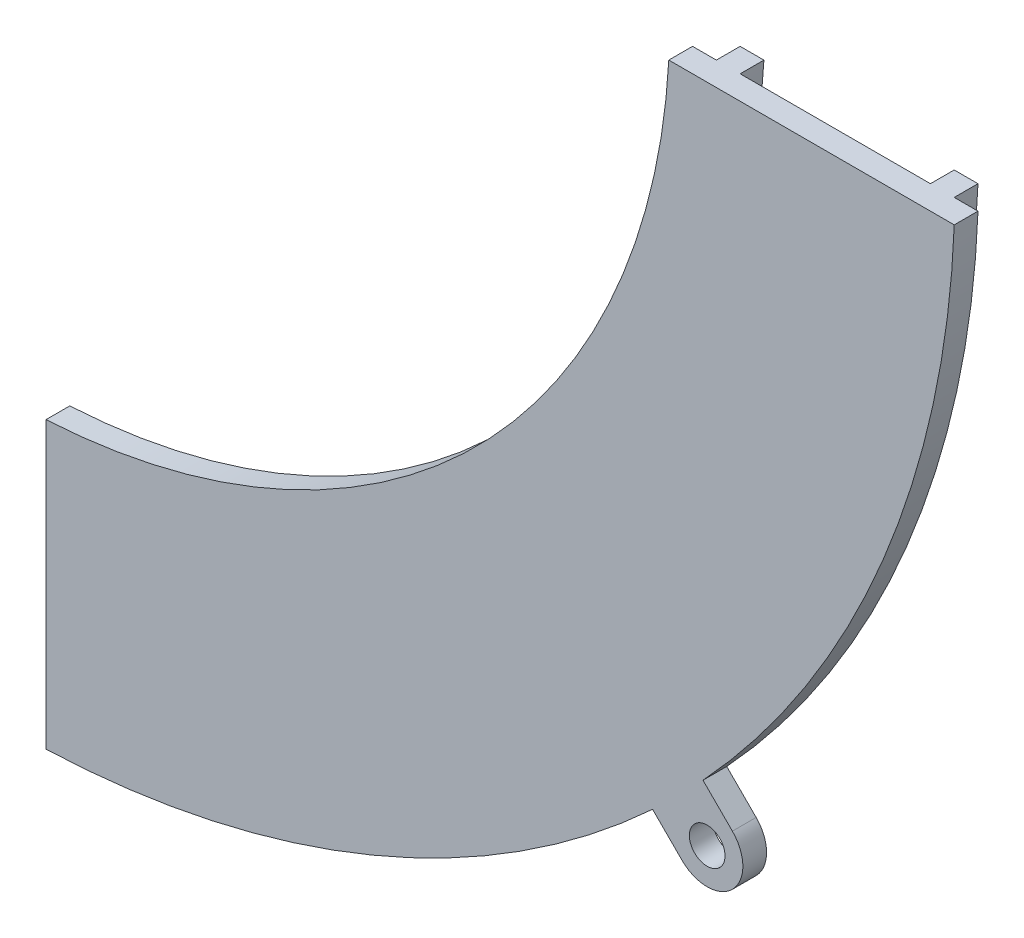
ISO-10303-21;
HEADER;
FILE_DESCRIPTION(('STEP AP214'),'2;1');
FILE_NAME('part.step','',(''),(''),'','','');
FILE_SCHEMA(('AUTOMOTIVE_DESIGN { 1 0 10303 214 1 1 1 1 }'));
ENDSEC;
DATA;
#1=APPLICATION_CONTEXT('core data for automotive mechanical design processes');
#2=APPLICATION_PROTOCOL_DEFINITION('international standard','automotive_design',2000,#1);
#3=PRODUCT_CONTEXT('',#1,'mechanical');
#4=PRODUCT('Part','Part','',(#3));
#5=PRODUCT_RELATED_PRODUCT_CATEGORY('part','',(#4));
#6=PRODUCT_DEFINITION_FORMATION('','',#4);
#7=PRODUCT_DEFINITION_CONTEXT('part definition',#1,'design');
#8=PRODUCT_DEFINITION('design','',#6,#7);
#9=PRODUCT_DEFINITION_SHAPE('','',#8);
#10=(LENGTH_UNIT() NAMED_UNIT(*) SI_UNIT(.MILLI.,.METRE.));
#11=(NAMED_UNIT(*) PLANE_ANGLE_UNIT() SI_UNIT($,.RADIAN.));
#12=(NAMED_UNIT(*) SI_UNIT($,.STERADIAN.) SOLID_ANGLE_UNIT());
#13=UNCERTAINTY_MEASURE_WITH_UNIT(LENGTH_MEASURE(1.E-05),#10,'distance_accuracy_value','');
#14=(GEOMETRIC_REPRESENTATION_CONTEXT(3) GLOBAL_UNCERTAINTY_ASSIGNED_CONTEXT((#13)) GLOBAL_UNIT_ASSIGNED_CONTEXT((#10,
#11,#12)) REPRESENTATION_CONTEXT('',''));
#15=CARTESIAN_POINT('',(0.,0.,0.));
#16=DIRECTION('',(0.,0.,1.));
#17=DIRECTION('',(1.,0.,0.));
#18=AXIS2_PLACEMENT_3D('',#15,#16,#17);
#19=CARTESIAN_POINT('',(0.,0.,2.));
#20=DIRECTION('',(0.,0.,-1.));
#21=DIRECTION('',(-1.,0.,0.));
#22=AXIS2_PLACEMENT_3D('',#19,#20,#21);
#23=CYLINDRICAL_SURFACE('',#22,79.5);
#24=DIRECTION('',(0.,0.,1.));
#25=VECTOR('',#24,1.);
#26=CARTESIAN_POINT('',(58.2962702767819,-54.0536295896621,0.));
#27=LINE('',#26,#25);
#28=CARTESIAN_POINT('',(58.2962702767819,-54.0536295896621,0.));
#29=VERTEX_POINT('',#28);
#30=CARTESIAN_POINT('',(58.2962702767817,-54.0536295896623,2.));
#31=VERTEX_POINT('',#30);
#32=EDGE_CURVE('E181',#29,#31,#27,.T.);
#33=ORIENTED_EDGE('',*,*,#32,.F.);
#34=CARTESIAN_POINT('',(0.,0.,0.));
#35=DIRECTION('',(0.,0.,1.));
#36=DIRECTION('',(1.,0.,0.));
#37=AXIS2_PLACEMENT_3D('',#34,#35,#36);
#38=CIRCLE('',#37,79.5);
#39=CARTESIAN_POINT('',(79.4433760611922,-3.,0.));
#40=VERTEX_POINT('',#39);
#41=EDGE_CURVE('E169',#29,#40,#38,.T.);
#42=ORIENTED_EDGE('',*,*,#41,.T.);
#43=DIRECTION('',(0.,0.,-1.));
#44=VECTOR('',#43,1.);
#45=CARTESIAN_POINT('',(79.4433760611922,-3.,2.));
#46=LINE('',#45,#44);
#47=CARTESIAN_POINT('',(79.4433760611922,-3.,2.));
#48=VERTEX_POINT('',#47);
#49=EDGE_CURVE('E56',#48,#40,#46,.T.);
#50=ORIENTED_EDGE('',*,*,#49,.F.);
#51=CARTESIAN_POINT('',(0.,0.,2.));
#52=DIRECTION('',(0.,0.,1.));
#53=DIRECTION('',(1.,0.,0.));
#54=AXIS2_PLACEMENT_3D('',#51,#52,#53);
#55=CIRCLE('',#54,79.5);
#56=EDGE_CURVE('E293',#31,#48,#55,.T.);
#57=ORIENTED_EDGE('',*,*,#56,.F.);
#58=EDGE_LOOP('',(#33,#42,#50,#57));
#59=FACE_BOUND('',#58,.T.);
#60=ADVANCED_FACE('F47',(#59),#23,.T.);
#61=CARTESIAN_POINT('',(0.,0.,0.));
#62=DIRECTION('',(0.,0.,1.));
#63=DIRECTION('',(1.,0.,0.));
#64=AXIS2_PLACEMENT_3D('',#61,#62,#63);
#65=PLANE('',#64);
#66=DIRECTION('',(1.,0.,0.));
#67=VECTOR('',#66,1.);
#68=CARTESIAN_POINT('',(0.,-3.,0.));
#69=LINE('',#68,#67);
#70=CARTESIAN_POINT('',(59.4243216200236,-3.,0.));
#71=VERTEX_POINT('',#70);
#72=CARTESIAN_POINT('',(75.4403738060728,-3.,0.));
#73=VERTEX_POINT('',#72);
#74=EDGE_CURVE('E322',#71,#73,#69,.T.);
#75=ORIENTED_EDGE('',*,*,#74,.T.);
#76=CARTESIAN_POINT('',(0.,0.,0.));
#77=DIRECTION('',(0.,0.,-1.));
#78=DIRECTION('',(1.,0.,0.));
#79=AXIS2_PLACEMENT_3D('',#76,#77,#78);
#80=CIRCLE('',#79,75.5);
#81=CARTESIAN_POINT('',(3.00000000000001,-75.4403738060728,0.));
#82=VERTEX_POINT('',#81);
#83=EDGE_CURVE('E235',#73,#82,#80,.T.);
#84=ORIENTED_EDGE('',*,*,#83,.T.);
#85=DIRECTION('',(0.,-1.,0.));
#86=VECTOR('',#85,1.);
#87=CARTESIAN_POINT('',(3.00000000000001,0.,0.));
#88=LINE('',#87,#86);
#89=CARTESIAN_POINT('',(3.00000000000001,-59.4243216200236,0.));
#90=VERTEX_POINT('',#89);
#91=EDGE_CURVE('E312',#90,#82,#88,.T.);
#92=ORIENTED_EDGE('',*,*,#91,.F.);
#93=CARTESIAN_POINT('',(0.,0.,0.));
#94=DIRECTION('',(0.,0.,1.));
#95=DIRECTION('',(1.,0.,0.));
#96=AXIS2_PLACEMENT_3D('',#93,#94,#95);
#97=CIRCLE('',#96,59.5);
#98=EDGE_CURVE('E239',#90,#71,#97,.T.);
#99=ORIENTED_EDGE('',*,*,#98,.T.);
#100=EDGE_LOOP('',(#75,#84,#92,#99));
#101=FACE_BOUND('',#100,.T.);
#102=ADVANCED_FACE('F345',(#101),#65,.F.);
#103=CARTESIAN_POINT('',(3.00000000000001,-77.4419137160233,0.));
#104=VERTEX_POINT('',#103);
#105=CARTESIAN_POINT('',(3.00000000000001,-79.4433760611922,0.));
#106=VERTEX_POINT('',#105);
#107=EDGE_CURVE('E71',#104,#106,#88,.T.);
#108=ORIENTED_EDGE('',*,*,#107,.F.);
#109=CARTESIAN_POINT('',(0.,0.,0.));
#110=DIRECTION('',(0.,0.,1.));
#111=DIRECTION('',(1.,0.,0.));
#112=AXIS2_PLACEMENT_3D('',#109,#110,#111);
#113=CIRCLE('',#112,77.5);
#114=CARTESIAN_POINT('',(77.4419137160233,-3.,0.));
#115=VERTEX_POINT('',#114);
#116=EDGE_CURVE('E232',#104,#115,#113,.T.);
#117=ORIENTED_EDGE('',*,*,#116,.T.);
#118=EDGE_CURVE('E317',#115,#40,#69,.T.);
#119=ORIENTED_EDGE('',*,*,#118,.T.);
#120=ORIENTED_EDGE('',*,*,#41,.F.);
#121=DIRECTION('',(0.707106781186545,-0.707106781186551,0.));
#122=VECTOR('',#121,1.);
#123=CARTESIAN_POINT('',(2.12132034355995,2.12132034355993,0.));
#124=LINE('',#123,#122);
#125=CARTESIAN_POINT('',(60.7711440109346,-56.5285033238152,0.));
#126=VERTEX_POINT('',#125);
#127=EDGE_CURVE('E160',#29,#126,#124,.T.);
#128=ORIENTED_EDGE('',*,*,#127,.T.);
#129=CARTESIAN_POINT('',(58.649823667375,-58.6498236673749,0.));
#130=DIRECTION('',(0.,0.,1.));
#131=DIRECTION('',(1.,0.,0.));
#132=AXIS2_PLACEMENT_3D('',#129,#130,#131);
#133=CIRCLE('',#132,3.00000000000007);
#134=CARTESIAN_POINT('',(56.5285033238153,-60.7711440109345,0.));
#135=VERTEX_POINT('',#134);
#136=EDGE_CURVE('E166',#126,#135,#133,.F.);
#137=ORIENTED_EDGE('',*,*,#136,.T.);
#138=DIRECTION('',(0.707106781186548,-0.707106781186547,0.));
#139=VECTOR('',#138,1.);
#140=CARTESIAN_POINT('',(-2.12132034355966,-2.12132034355967,0.));
#141=LINE('',#140,#139);
#142=CARTESIAN_POINT('',(54.0536295896624,-58.2962702767816,0.));
#143=VERTEX_POINT('',#142);
#144=EDGE_CURVE('E173',#143,#135,#141,.T.);
#145=ORIENTED_EDGE('',*,*,#144,.F.);
#146=EDGE_CURVE('E313',#106,#143,#38,.T.);
#147=ORIENTED_EDGE('',*,*,#146,.F.);
#148=EDGE_LOOP('',(#108,#117,#119,#120,#128,#137,#145,#147));
#149=FACE_BOUND('',#148,.T.);
#150=CARTESIAN_POINT('',(58.649823667375,-58.6498236673749,0.));
#151=DIRECTION('',(0.,0.,1.));
#152=DIRECTION('',(1.,0.,0.));
#153=AXIS2_PLACEMENT_3D('',#150,#151,#152);
#154=CIRCLE('',#153,1.5);
#155=CARTESIAN_POINT('',(60.149823667375,-58.6498236673749,0.));
#156=VERTEX_POINT('',#155);
#157=EDGE_CURVE('E187',#156,#156,#154,.T.);
#158=ORIENTED_EDGE('',*,*,#157,.T.);
#159=EDGE_LOOP('',(#158));
#160=FACE_BOUND('',#159,.T.);
#161=ADVANCED_FACE('F162',(#149,#160),#65,.F.);
#162=CARTESIAN_POINT('',(55.4188596057335,-3.,0.));
#163=VERTEX_POINT('',#162);
#164=CARTESIAN_POINT('',(57.421685799008,-3.,0.));
#165=VERTEX_POINT('',#164);
#166=EDGE_CURVE('E318',#163,#165,#69,.T.);
#167=ORIENTED_EDGE('',*,*,#166,.T.);
#168=CARTESIAN_POINT('',(0.,0.,0.));
#169=DIRECTION('',(0.,0.,-1.));
#170=DIRECTION('',(1.,0.,0.));
#171=AXIS2_PLACEMENT_3D('',#168,#169,#170);
#172=CIRCLE('',#171,57.5);
#173=CARTESIAN_POINT('',(3.00000000000001,-57.421685799008,0.));
#174=VERTEX_POINT('',#173);
#175=EDGE_CURVE('E259',#165,#174,#172,.T.);
#176=ORIENTED_EDGE('',*,*,#175,.T.);
#177=CARTESIAN_POINT('',(3.00000000000001,-55.4188596057335,0.));
#178=VERTEX_POINT('',#177);
#179=EDGE_CURVE('E308',#178,#174,#88,.T.);
#180=ORIENTED_EDGE('',*,*,#179,.F.);
#181=CARTESIAN_POINT('',(0.,0.,0.));
#182=DIRECTION('',(0.,0.,1.));
#183=DIRECTION('',(1.,0.,0.));
#184=AXIS2_PLACEMENT_3D('',#181,#182,#183);
#185=CIRCLE('',#184,55.5);
#186=EDGE_CURVE('E294',#178,#163,#185,.T.);
#187=ORIENTED_EDGE('',*,*,#186,.T.);
#188=EDGE_LOOP('',(#167,#176,#180,#187));
#189=FACE_BOUND('',#188,.T.);
#190=ADVANCED_FACE('F373',(#189),#65,.F.);
#191=CARTESIAN_POINT('',(3.00000000000001,0.,2.));
#192=DIRECTION('',(1.,0.,0.));
#193=DIRECTION('',(0.,0.,-1.));
#194=AXIS2_PLACEMENT_3D('',#191,#192,#193);
#195=PLANE('',#194);
#196=ORIENTED_EDGE('',*,*,#179,.T.);
#197=DIRECTION('',(0.,0.,1.));
#198=VECTOR('',#197,1.);
#199=CARTESIAN_POINT('',(2.99999999999999,-57.421685799008,-2.));
#200=LINE('',#199,#198);
#201=CARTESIAN_POINT('',(2.99999999999999,-57.421685799008,-2.));
#202=VERTEX_POINT('',#201);
#203=EDGE_CURVE('E281',#202,#174,#200,.T.);
#204=ORIENTED_EDGE('',*,*,#203,.F.);
#205=DIRECTION('',(0.,-1.,0.));
#206=VECTOR('',#205,1.);
#207=CARTESIAN_POINT('',(3.00000000000001,-57.421685799008,-2.));
#208=LINE('',#207,#206);
#209=CARTESIAN_POINT('',(3.00000000000001,-59.4243216200236,-2.));
#210=VERTEX_POINT('',#209);
#211=EDGE_CURVE('E267',#202,#210,#208,.T.);
#212=ORIENTED_EDGE('',*,*,#211,.T.);
#213=DIRECTION('',(0.,0.,1.));
#214=VECTOR('',#213,1.);
#215=CARTESIAN_POINT('',(3.00000000000001,-59.4243216200236,-2.));
#216=LINE('',#215,#214);
#217=EDGE_CURVE('E278',#210,#90,#216,.T.);
#218=ORIENTED_EDGE('',*,*,#217,.T.);
#219=ORIENTED_EDGE('',*,*,#91,.T.);
#220=DIRECTION('',(0.,0.,1.));
#221=VECTOR('',#220,1.);
#222=CARTESIAN_POINT('',(3.00000000000001,-75.4403738060728,-2.));
#223=LINE('',#222,#221);
#224=CARTESIAN_POINT('',(3.00000000000001,-75.4403738060728,-2.));
#225=VERTEX_POINT('',#224);
#226=EDGE_CURVE('E217',#225,#82,#223,.T.);
#227=ORIENTED_EDGE('',*,*,#226,.F.);
#228=DIRECTION('',(0.,-1.,0.));
#229=VECTOR('',#228,1.);
#230=CARTESIAN_POINT('',(3.00000000000001,-75.4403738060728,-2.));
#231=LINE('',#230,#229);
#232=CARTESIAN_POINT('',(2.99999999999999,-77.4419137160233,-2.));
#233=VERTEX_POINT('',#232);
#234=EDGE_CURVE('E247',#225,#233,#231,.T.);
#235=ORIENTED_EDGE('',*,*,#234,.T.);
#236=DIRECTION('',(0.,0.,1.));
#237=VECTOR('',#236,1.);
#238=CARTESIAN_POINT('',(2.99999999999999,-77.4419137160233,-2.));
#239=LINE('',#238,#237);
#240=EDGE_CURVE('E222',#233,#104,#239,.T.);
#241=ORIENTED_EDGE('',*,*,#240,.T.);
#242=ORIENTED_EDGE('',*,*,#107,.T.);
#243=DIRECTION('',(0.,0.,-1.));
#244=VECTOR('',#243,1.);
#245=CARTESIAN_POINT('',(3.00000000000001,-79.4433760611922,2.));
#246=LINE('',#245,#244);
#247=CARTESIAN_POINT('',(3.00000000000001,-79.4433760611922,2.));
#248=VERTEX_POINT('',#247);
#249=EDGE_CURVE('E11',#248,#106,#246,.T.);
#250=ORIENTED_EDGE('',*,*,#249,.F.);
#251=DIRECTION('',(0.,-1.,0.));
#252=VECTOR('',#251,1.);
#253=CARTESIAN_POINT('',(3.00000000000001,0.,2.));
#254=LINE('',#253,#252);
#255=CARTESIAN_POINT('',(3.00000000000001,-55.4188596057335,2.));
#256=VERTEX_POINT('',#255);
#257=EDGE_CURVE('E289',#256,#248,#254,.T.);
#258=ORIENTED_EDGE('',*,*,#257,.F.);
#259=DIRECTION('',(0.,0.,-1.));
#260=VECTOR('',#259,1.);
#261=CARTESIAN_POINT('',(3.00000000000001,-55.4188596057335,2.));
#262=LINE('',#261,#260);
#263=EDGE_CURVE('E307',#256,#178,#262,.T.);
#264=ORIENTED_EDGE('',*,*,#263,.T.);
#265=EDGE_LOOP('',(#196,#204,#212,#218,#219,#227,#235,#241,#242,#250,#258,#264));
#266=FACE_BOUND('',#265,.T.);
#267=ADVANCED_FACE('F49',(#266),#195,.F.);
#268=ORIENTED_EDGE('',*,*,#146,.T.);
#269=DIRECTION('',(0.,0.,1.));
#270=VECTOR('',#269,1.);
#271=CARTESIAN_POINT('',(54.0536295896624,-58.2962702767816,0.));
#272=LINE('',#271,#270);
#273=CARTESIAN_POINT('',(54.0536295896624,-58.2962702767816,2.));
#274=VERTEX_POINT('',#273);
#275=EDGE_CURVE('E211',#143,#274,#272,.T.);
#276=ORIENTED_EDGE('',*,*,#275,.T.);
#277=EDGE_CURVE('E295',#248,#274,#55,.T.);
#278=ORIENTED_EDGE('',*,*,#277,.F.);
#279=ORIENTED_EDGE('',*,*,#249,.T.);
#280=EDGE_LOOP('',(#268,#276,#278,#279));
#281=FACE_BOUND('',#280,.T.);
#282=ADVANCED_FACE('F365',(#281),#23,.T.);
#283=CARTESIAN_POINT('',(0.,-3.,2.));
#284=DIRECTION('',(0.,1.,0.));
#285=DIRECTION('',(0.,0.,1.));
#286=AXIS2_PLACEMENT_3D('',#283,#284,#285);
#287=PLANE('',#286);
#288=ORIENTED_EDGE('',*,*,#166,.F.);
#289=DIRECTION('',(0.,0.,-1.));
#290=VECTOR('',#289,1.);
#291=CARTESIAN_POINT('',(55.4188596057335,-3.,2.));
#292=LINE('',#291,#290);
#293=CARTESIAN_POINT('',(55.4188596057335,-3.,2.));
#294=VERTEX_POINT('',#293);
#295=EDGE_CURVE('E328',#294,#163,#292,.T.);
#296=ORIENTED_EDGE('',*,*,#295,.F.);
#297=DIRECTION('',(1.,0.,0.));
#298=VECTOR('',#297,1.);
#299=CARTESIAN_POINT('',(0.,-3.,2.));
#300=LINE('',#299,#298);
#301=EDGE_CURVE('E299',#294,#48,#300,.T.);
#302=ORIENTED_EDGE('',*,*,#301,.T.);
#303=ORIENTED_EDGE('',*,*,#49,.T.);
#304=ORIENTED_EDGE('',*,*,#118,.F.);
#305=DIRECTION('',(0.,0.,1.));
#306=VECTOR('',#305,1.);
#307=CARTESIAN_POINT('',(77.4419137160233,-3.,-2.));
#308=LINE('',#307,#306);
#309=CARTESIAN_POINT('',(77.4419137160233,-3.,-2.));
#310=VERTEX_POINT('',#309);
#311=EDGE_CURVE('E225',#310,#115,#308,.T.);
#312=ORIENTED_EDGE('',*,*,#311,.F.);
#313=DIRECTION('',(-1.,0.,0.));
#314=VECTOR('',#313,1.);
#315=CARTESIAN_POINT('',(77.4419137160233,-3.,-2.));
#316=LINE('',#315,#314);
#317=CARTESIAN_POINT('',(75.4403738060728,-3.,-2.));
#318=VERTEX_POINT('',#317);
#319=EDGE_CURVE('E221',#310,#318,#316,.T.);
#320=ORIENTED_EDGE('',*,*,#319,.T.);
#321=DIRECTION('',(0.,0.,1.));
#322=VECTOR('',#321,1.);
#323=CARTESIAN_POINT('',(75.4403738060728,-3.,-2.));
#324=LINE('',#323,#322);
#325=EDGE_CURVE('E210',#318,#73,#324,.T.);
#326=ORIENTED_EDGE('',*,*,#325,.T.);
#327=ORIENTED_EDGE('',*,*,#74,.F.);
#328=DIRECTION('',(0.,0.,1.));
#329=VECTOR('',#328,1.);
#330=CARTESIAN_POINT('',(59.4243216200236,-3.,-2.));
#331=LINE('',#330,#329);
#332=CARTESIAN_POINT('',(59.4243216200236,-3.,-2.));
#333=VERTEX_POINT('',#332);
#334=EDGE_CURVE('E271',#333,#71,#331,.T.);
#335=ORIENTED_EDGE('',*,*,#334,.F.);
#336=DIRECTION('',(-1.,0.,0.));
#337=VECTOR('',#336,1.);
#338=CARTESIAN_POINT('',(59.4243216200236,-3.,-2.));
#339=LINE('',#338,#337);
#340=CARTESIAN_POINT('',(57.421685799008,-3.,-2.));
#341=VERTEX_POINT('',#340);
#342=EDGE_CURVE('E258',#333,#341,#339,.T.);
#343=ORIENTED_EDGE('',*,*,#342,.T.);
#344=DIRECTION('',(0.,0.,1.));
#345=VECTOR('',#344,1.);
#346=CARTESIAN_POINT('',(57.421685799008,-3.,-2.));
#347=LINE('',#346,#345);
#348=EDGE_CURVE('E284',#341,#165,#347,.T.);
#349=ORIENTED_EDGE('',*,*,#348,.T.);
#350=EDGE_LOOP('',(#288,#296,#302,#303,#304,#312,#320,#326,#327,#335,#343,#349));
#351=FACE_BOUND('',#350,.T.);
#352=ADVANCED_FACE('F335',(#351),#287,.T.);
#353=CARTESIAN_POINT('',(0.,0.,2.));
#354=DIRECTION('',(0.,0.,-1.));
#355=DIRECTION('',(-1.,0.,0.));
#356=AXIS2_PLACEMENT_3D('',#353,#354,#355);
#357=CYLINDRICAL_SURFACE('',#356,55.5);
#358=ORIENTED_EDGE('',*,*,#186,.F.);
#359=ORIENTED_EDGE('',*,*,#263,.F.);
#360=CARTESIAN_POINT('',(0.,0.,2.));
#361=DIRECTION('',(0.,0.,1.));
#362=DIRECTION('',(1.,0.,0.));
#363=AXIS2_PLACEMENT_3D('',#360,#361,#362);
#364=CIRCLE('',#363,55.5);
#365=EDGE_CURVE('E303',#256,#294,#364,.T.);
#366=ORIENTED_EDGE('',*,*,#365,.T.);
#367=ORIENTED_EDGE('',*,*,#295,.T.);
#368=EDGE_LOOP('',(#358,#359,#366,#367));
#369=FACE_BOUND('',#368,.T.);
#370=ADVANCED_FACE('F375',(#369),#357,.F.);
#371=CARTESIAN_POINT('',(0.,0.,2.));
#372=DIRECTION('',(0.,0.,1.));
#373=DIRECTION('',(1.,0.,0.));
#374=AXIS2_PLACEMENT_3D('',#371,#372,#373);
#375=PLANE('',#374);
#376=ORIENTED_EDGE('',*,*,#257,.T.);
#377=ORIENTED_EDGE('',*,*,#277,.T.);
#378=DIRECTION('',(0.707106781186548,-0.707106781186547,0.));
#379=VECTOR('',#378,1.);
#380=CARTESIAN_POINT('',(-2.12132034355966,-2.12132034355967,2.));
#381=LINE('',#380,#379);
#382=CARTESIAN_POINT('',(56.5285033238153,-60.7711440109345,2.));
#383=VERTEX_POINT('',#382);
#384=EDGE_CURVE('E191',#274,#383,#381,.T.);
#385=ORIENTED_EDGE('',*,*,#384,.T.);
#386=CARTESIAN_POINT('',(58.649823667375,-58.6498236673749,2.));
#387=DIRECTION('',(0.,0.,1.));
#388=DIRECTION('',(1.,0.,0.));
#389=AXIS2_PLACEMENT_3D('',#386,#387,#388);
#390=CIRCLE('',#389,3.00000000000007);
#391=CARTESIAN_POINT('',(60.7711440109346,-56.5285033238152,2.));
#392=VERTEX_POINT('',#391);
#393=EDGE_CURVE('E200',#392,#383,#390,.F.);
#394=ORIENTED_EDGE('',*,*,#393,.F.);
#395=DIRECTION('',(0.707106781186545,-0.707106781186551,0.));
#396=VECTOR('',#395,1.);
#397=CARTESIAN_POINT('',(2.12132034355995,2.12132034355993,2.));
#398=LINE('',#397,#396);
#399=EDGE_CURVE('E63',#31,#392,#398,.T.);
#400=ORIENTED_EDGE('',*,*,#399,.F.);
#401=ORIENTED_EDGE('',*,*,#56,.T.);
#402=ORIENTED_EDGE('',*,*,#301,.F.);
#403=ORIENTED_EDGE('',*,*,#365,.F.);
#404=EDGE_LOOP('',(#376,#377,#385,#394,#400,#401,#402,#403));
#405=FACE_BOUND('',#404,.T.);
#406=CARTESIAN_POINT('',(58.649823667375,-58.6498236673749,2.));
#407=DIRECTION('',(0.,0.,1.));
#408=DIRECTION('',(1.,0.,0.));
#409=AXIS2_PLACEMENT_3D('',#406,#407,#408);
#410=CIRCLE('',#409,1.5);
#411=CARTESIAN_POINT('',(60.149823667375,-58.6498236673749,2.));
#412=VERTEX_POINT('',#411);
#413=EDGE_CURVE('E196',#412,#412,#410,.T.);
#414=ORIENTED_EDGE('',*,*,#413,.F.);
#415=EDGE_LOOP('',(#414));
#416=FACE_BOUND('',#415,.T.);
#417=ADVANCED_FACE('F367',(#405,#416),#375,.T.);
#418=CARTESIAN_POINT('',(0.,0.,-2.));
#419=DIRECTION('',(0.,0.,1.));
#420=DIRECTION('',(1.,0.,0.));
#421=AXIS2_PLACEMENT_3D('',#418,#419,#420);
#422=CYLINDRICAL_SURFACE('',#421,59.5);
#423=ORIENTED_EDGE('',*,*,#98,.F.);
#424=ORIENTED_EDGE('',*,*,#217,.F.);
#425=CARTESIAN_POINT('',(0.,0.,-2.));
#426=DIRECTION('',(0.,0.,1.));
#427=DIRECTION('',(1.,0.,0.));
#428=AXIS2_PLACEMENT_3D('',#425,#426,#427);
#429=CIRCLE('',#428,59.5);
#430=EDGE_CURVE('E254',#210,#333,#429,.T.);
#431=ORIENTED_EDGE('',*,*,#430,.T.);
#432=ORIENTED_EDGE('',*,*,#334,.T.);
#433=EDGE_LOOP('',(#423,#424,#431,#432));
#434=FACE_BOUND('',#433,.T.);
#435=ADVANCED_FACE('F385',(#434),#422,.T.);
#436=CARTESIAN_POINT('',(0.,0.,-2.));
#437=DIRECTION('',(0.,0.,1.));
#438=DIRECTION('',(1.,0.,0.));
#439=AXIS2_PLACEMENT_3D('',#436,#437,#438);
#440=CYLINDRICAL_SURFACE('',#439,57.5);
#441=ORIENTED_EDGE('',*,*,#175,.F.);
#442=ORIENTED_EDGE('',*,*,#348,.F.);
#443=CARTESIAN_POINT('',(0.,0.,-2.));
#444=DIRECTION('',(0.,0.,-1.));
#445=DIRECTION('',(1.,0.,0.));
#446=AXIS2_PLACEMENT_3D('',#443,#444,#445);
#447=CIRCLE('',#446,57.5);
#448=EDGE_CURVE('E263',#341,#202,#447,.T.);
#449=ORIENTED_EDGE('',*,*,#448,.T.);
#450=ORIENTED_EDGE('',*,*,#203,.T.);
#451=EDGE_LOOP('',(#441,#442,#449,#450));
#452=FACE_BOUND('',#451,.T.);
#453=ADVANCED_FACE('F379',(#452),#440,.F.);
#454=CARTESIAN_POINT('',(0.,0.,-2.));
#455=DIRECTION('',(0.,0.,1.));
#456=DIRECTION('',(1.,0.,0.));
#457=AXIS2_PLACEMENT_3D('',#454,#455,#456);
#458=PLANE('',#457);
#459=ORIENTED_EDGE('',*,*,#430,.F.);
#460=ORIENTED_EDGE('',*,*,#211,.F.);
#461=ORIENTED_EDGE('',*,*,#448,.F.);
#462=ORIENTED_EDGE('',*,*,#342,.F.);
#463=EDGE_LOOP('',(#459,#460,#461,#462));
#464=FACE_BOUND('',#463,.T.);
#465=ADVANCED_FACE('F383',(#464),#458,.F.);
#466=CARTESIAN_POINT('',(0.,0.,-2.));
#467=DIRECTION('',(0.,0.,1.));
#468=DIRECTION('',(1.,0.,0.));
#469=AXIS2_PLACEMENT_3D('',#466,#467,#468);
#470=CYLINDRICAL_SURFACE('',#469,75.5);
#471=ORIENTED_EDGE('',*,*,#83,.F.);
#472=ORIENTED_EDGE('',*,*,#325,.F.);
#473=CARTESIAN_POINT('',(0.,0.,-2.));
#474=DIRECTION('',(0.,0.,-1.));
#475=DIRECTION('',(1.,0.,0.));
#476=AXIS2_PLACEMENT_3D('',#473,#474,#475);
#477=CIRCLE('',#476,75.5);
#478=EDGE_CURVE('E236',#318,#225,#477,.T.);
#479=ORIENTED_EDGE('',*,*,#478,.T.);
#480=ORIENTED_EDGE('',*,*,#226,.T.);
#481=EDGE_LOOP('',(#471,#472,#479,#480));
#482=FACE_BOUND('',#481,.T.);
#483=ADVANCED_FACE('F353',(#482),#470,.F.);
#484=CARTESIAN_POINT('',(0.,0.,-2.));
#485=DIRECTION('',(0.,0.,1.));
#486=DIRECTION('',(1.,0.,0.));
#487=AXIS2_PLACEMENT_3D('',#484,#485,#486);
#488=CYLINDRICAL_SURFACE('',#487,77.5);
#489=ORIENTED_EDGE('',*,*,#116,.F.);
#490=ORIENTED_EDGE('',*,*,#240,.F.);
#491=CARTESIAN_POINT('',(0.,0.,-2.));
#492=DIRECTION('',(0.,0.,1.));
#493=DIRECTION('',(1.,0.,0.));
#494=AXIS2_PLACEMENT_3D('',#491,#492,#493);
#495=CIRCLE('',#494,77.5);
#496=EDGE_CURVE('E243',#233,#310,#495,.T.);
#497=ORIENTED_EDGE('',*,*,#496,.T.);
#498=ORIENTED_EDGE('',*,*,#311,.T.);
#499=EDGE_LOOP('',(#489,#490,#497,#498));
#500=FACE_BOUND('',#499,.T.);
#501=ADVANCED_FACE('F360',(#500),#488,.T.);
#502=CARTESIAN_POINT('',(0.,0.,-2.));
#503=DIRECTION('',(0.,0.,1.));
#504=DIRECTION('',(1.,0.,0.));
#505=AXIS2_PLACEMENT_3D('',#502,#503,#504);
#506=PLANE('',#505);
#507=ORIENTED_EDGE('',*,*,#478,.F.);
#508=ORIENTED_EDGE('',*,*,#319,.F.);
#509=ORIENTED_EDGE('',*,*,#496,.F.);
#510=ORIENTED_EDGE('',*,*,#234,.F.);
#511=EDGE_LOOP('',(#507,#508,#509,#510));
#512=FACE_BOUND('',#511,.T.);
#513=ADVANCED_FACE('F358',(#512),#506,.F.);
#514=CARTESIAN_POINT('',(58.649823667375,-58.6498236673749,0.));
#515=DIRECTION('',(0.,0.,1.));
#516=DIRECTION('',(1.,0.,0.));
#517=AXIS2_PLACEMENT_3D('',#514,#515,#516);
#518=CYLINDRICAL_SURFACE('',#517,3.00000000000007);
#519=ORIENTED_EDGE('',*,*,#393,.T.);
#520=DIRECTION('',(0.,0.,1.));
#521=VECTOR('',#520,1.);
#522=CARTESIAN_POINT('',(56.5285033238153,-60.7711440109345,0.));
#523=LINE('',#522,#521);
#524=EDGE_CURVE('E184',#135,#383,#523,.T.);
#525=ORIENTED_EDGE('',*,*,#524,.F.);
#526=ORIENTED_EDGE('',*,*,#136,.F.);
#527=DIRECTION('',(0.,0.,1.));
#528=VECTOR('',#527,1.);
#529=CARTESIAN_POINT('',(60.7711440109346,-56.5285033238152,0.));
#530=LINE('',#529,#528);
#531=EDGE_CURVE('E176',#126,#392,#530,.T.);
#532=ORIENTED_EDGE('',*,*,#531,.T.);
#533=EDGE_LOOP('',(#519,#525,#526,#532));
#534=FACE_BOUND('',#533,.T.);
#535=ADVANCED_FACE('F183',(#534),#518,.T.);
#536=CARTESIAN_POINT('',(-2.12132034355966,-2.12132034355967,0.));
#537=DIRECTION('',(-0.707106781186547,-0.707106781186548,0.));
#538=DIRECTION('',(0.707106781186548,-0.707106781186547,0.));
#539=AXIS2_PLACEMENT_3D('',#536,#537,#538);
#540=PLANE('',#539);
#541=ORIENTED_EDGE('',*,*,#384,.F.);
#542=ORIENTED_EDGE('',*,*,#275,.F.);
#543=ORIENTED_EDGE('',*,*,#144,.T.);
#544=ORIENTED_EDGE('',*,*,#524,.T.);
#545=EDGE_LOOP('',(#541,#542,#543,#544));
#546=FACE_BOUND('',#545,.T.);
#547=ADVANCED_FACE('F517',(#546),#540,.T.);
#548=CARTESIAN_POINT('',(58.649823667375,-58.6498236673749,0.));
#549=DIRECTION('',(0.,0.,1.));
#550=DIRECTION('',(1.,0.,0.));
#551=AXIS2_PLACEMENT_3D('',#548,#549,#550);
#552=CYLINDRICAL_SURFACE('',#551,1.5);
#553=ORIENTED_EDGE('',*,*,#157,.F.);
#554=EDGE_LOOP('',(#553));
#555=FACE_BOUND('',#554,.T.);
#556=ORIENTED_EDGE('',*,*,#413,.T.);
#557=EDGE_LOOP('',(#556));
#558=FACE_BOUND('',#557,.T.);
#559=ADVANCED_FACE('F526',(#555,#558),#552,.F.);
#560=CARTESIAN_POINT('',(2.12132034355995,2.12132034355993,0.));
#561=DIRECTION('',(-0.707106781186551,-0.707106781186545,0.));
#562=DIRECTION('',(0.707106781186545,-0.707106781186551,0.));
#563=AXIS2_PLACEMENT_3D('',#560,#561,#562);
#564=PLANE('',#563);
#565=ORIENTED_EDGE('',*,*,#399,.T.);
#566=ORIENTED_EDGE('',*,*,#531,.F.);
#567=ORIENTED_EDGE('',*,*,#127,.F.);
#568=ORIENTED_EDGE('',*,*,#32,.T.);
#569=EDGE_LOOP('',(#565,#566,#567,#568));
#570=FACE_BOUND('',#569,.T.);
#571=ADVANCED_FACE('F177',(#570),#564,.F.);
#572=CLOSED_SHELL('',(#60,#102,#161,#190,#267,#282,#352,#370,#417,#435,#453,#465,#483,#501,#513,
#535,#547,#559,#571));
#573=MANIFOLD_SOLID_BREP('B2',#572);
#574=ADVANCED_BREP_SHAPE_REPRESENTATION('',(#18,#573),#14);
#575=SHAPE_DEFINITION_REPRESENTATION(#9,#574);
ENDSEC;
END-ISO-10303-21;
